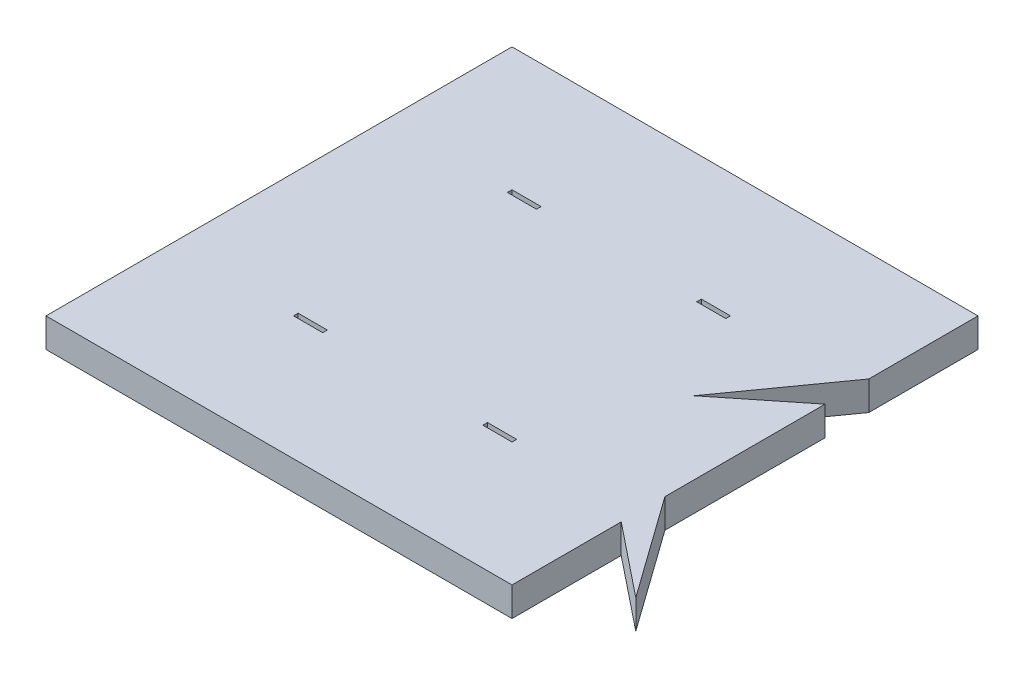
ISO-10303-21;
HEADER;
FILE_DESCRIPTION(('STEP AP214'),'2;1');
FILE_NAME('part.step','',(''),(''),'','','');
FILE_SCHEMA(('AUTOMOTIVE_DESIGN { 1 0 10303 214 1 1 1 1 }'));
ENDSEC;
DATA;
#1=APPLICATION_CONTEXT('core data for automotive mechanical design processes');
#2=APPLICATION_PROTOCOL_DEFINITION('international standard','automotive_design',2000,#1);
#3=PRODUCT_CONTEXT('',#1,'mechanical');
#4=PRODUCT('Part','Part','',(#3));
#5=PRODUCT_RELATED_PRODUCT_CATEGORY('part','',(#4));
#6=PRODUCT_DEFINITION_FORMATION('','',#4);
#7=PRODUCT_DEFINITION_CONTEXT('part definition',#1,'design');
#8=PRODUCT_DEFINITION('design','',#6,#7);
#9=PRODUCT_DEFINITION_SHAPE('','',#8);
#10=(LENGTH_UNIT() NAMED_UNIT(*) SI_UNIT(.MILLI.,.METRE.));
#11=(NAMED_UNIT(*) PLANE_ANGLE_UNIT() SI_UNIT($,.RADIAN.));
#12=(NAMED_UNIT(*) SI_UNIT($,.STERADIAN.) SOLID_ANGLE_UNIT());
#13=UNCERTAINTY_MEASURE_WITH_UNIT(LENGTH_MEASURE(1.E-05),#10,'distance_accuracy_value','');
#14=(GEOMETRIC_REPRESENTATION_CONTEXT(3) GLOBAL_UNCERTAINTY_ASSIGNED_CONTEXT((#13)) GLOBAL_UNIT_ASSIGNED_CONTEXT((#10,
#11,#12)) REPRESENTATION_CONTEXT('',''));
#15=CARTESIAN_POINT('',(0.,0.,0.));
#16=DIRECTION('',(0.,0.,1.));
#17=DIRECTION('',(1.,0.,0.));
#18=AXIS2_PLACEMENT_3D('',#15,#16,#17);
#19=CARTESIAN_POINT('',(0.,20.,0.));
#20=DIRECTION('',(1.,0.,0.));
#21=DIRECTION('',(0.,0.,-1.));
#22=AXIS2_PLACEMENT_3D('',#19,#20,#21);
#23=PLANE('',#22);
#24=DIRECTION('',(0.,0.,1.));
#25=VECTOR('',#24,1.);
#26=CARTESIAN_POINT('',(0.,0.,0.));
#27=LINE('',#26,#25);
#28=CARTESIAN_POINT('',(0.,0.,-320.));
#29=VERTEX_POINT('',#28);
#30=CARTESIAN_POINT('',(0.,0.,0.));
#31=VERTEX_POINT('',#30);
#32=EDGE_CURVE('E334',#29,#31,#27,.T.);
#33=ORIENTED_EDGE('',*,*,#32,.T.);
#34=DIRECTION('',(0.,-1.,0.));
#35=VECTOR('',#34,1.);
#36=CARTESIAN_POINT('',(0.,20.,0.));
#37=LINE('',#36,#35);
#38=CARTESIAN_POINT('',(0.,20.,0.));
#39=VERTEX_POINT('',#38);
#40=EDGE_CURVE('E11',#39,#31,#37,.T.);
#41=ORIENTED_EDGE('',*,*,#40,.F.);
#42=DIRECTION('',(0.,0.,1.));
#43=VECTOR('',#42,1.);
#44=CARTESIAN_POINT('',(0.,20.,0.));
#45=LINE('',#44,#43);
#46=CARTESIAN_POINT('',(0.,20.,-320.));
#47=VERTEX_POINT('',#46);
#48=EDGE_CURVE('E341',#47,#39,#45,.T.);
#49=ORIENTED_EDGE('',*,*,#48,.F.);
#50=DIRECTION('',(0.,-1.,0.));
#51=VECTOR('',#50,1.);
#52=CARTESIAN_POINT('',(0.,20.,-320.));
#53=LINE('',#52,#51);
#54=EDGE_CURVE('E363',#47,#29,#53,.T.);
#55=ORIENTED_EDGE('',*,*,#54,.T.);
#56=EDGE_LOOP('',(#33,#41,#49,#55));
#57=FACE_BOUND('',#56,.T.);
#58=ADVANCED_FACE('F33',(#57),#23,.F.);
#59=CARTESIAN_POINT('',(0.,20.,0.));
#60=DIRECTION('',(0.,0.,-1.));
#61=DIRECTION('',(-1.,0.,0.));
#62=AXIS2_PLACEMENT_3D('',#59,#60,#61);
#63=PLANE('',#62);
#64=DIRECTION('',(1.,0.,0.));
#65=VECTOR('',#64,1.);
#66=CARTESIAN_POINT('',(0.,0.,0.));
#67=LINE('',#66,#65);
#68=CARTESIAN_POINT('',(320.,0.,0.));
#69=VERTEX_POINT('',#68);
#70=EDGE_CURVE('E366',#31,#69,#67,.T.);
#71=ORIENTED_EDGE('',*,*,#70,.T.);
#72=DIRECTION('',(0.,-1.,0.));
#73=VECTOR('',#72,1.);
#74=CARTESIAN_POINT('',(320.,20.,0.));
#75=LINE('',#74,#73);
#76=CARTESIAN_POINT('',(320.,20.,0.));
#77=VERTEX_POINT('',#76);
#78=EDGE_CURVE('E40',#77,#69,#75,.T.);
#79=ORIENTED_EDGE('',*,*,#78,.F.);
#80=DIRECTION('',(1.,0.,0.));
#81=VECTOR('',#80,1.);
#82=CARTESIAN_POINT('',(0.,20.,0.));
#83=LINE('',#82,#81);
#84=EDGE_CURVE('E344',#39,#77,#83,.T.);
#85=ORIENTED_EDGE('',*,*,#84,.F.);
#86=ORIENTED_EDGE('',*,*,#40,.T.);
#87=EDGE_LOOP('',(#71,#79,#85,#86));
#88=FACE_BOUND('',#87,.T.);
#89=ADVANCED_FACE('F432',(#88),#63,.F.);
#90=CARTESIAN_POINT('',(320.,20.,0.));
#91=DIRECTION('',(-1.,0.,0.));
#92=DIRECTION('',(0.,0.,1.));
#93=AXIS2_PLACEMENT_3D('',#90,#91,#92);
#94=PLANE('',#93);
#95=DIRECTION('',(0.,0.,-1.));
#96=VECTOR('',#95,1.);
#97=CARTESIAN_POINT('',(320.,0.,0.));
#98=LINE('',#97,#96);
#99=CARTESIAN_POINT('',(320.,0.,-75.));
#100=VERTEX_POINT('',#99);
#101=EDGE_CURVE('E368',#69,#100,#98,.T.);
#102=ORIENTED_EDGE('',*,*,#101,.T.);
#103=DIRECTION('',(0.,-1.,0.));
#104=VECTOR('',#103,1.);
#105=CARTESIAN_POINT('',(320.,20.,-75.));
#106=LINE('',#105,#104);
#107=CARTESIAN_POINT('',(320.,20.,-75.));
#108=VERTEX_POINT('',#107);
#109=EDGE_CURVE('E403',#108,#100,#106,.T.);
#110=ORIENTED_EDGE('',*,*,#109,.F.);
#111=DIRECTION('',(0.,0.,-1.));
#112=VECTOR('',#111,1.);
#113=CARTESIAN_POINT('',(320.,20.,0.));
#114=LINE('',#113,#112);
#115=EDGE_CURVE('E347',#77,#108,#114,.T.);
#116=ORIENTED_EDGE('',*,*,#115,.F.);
#117=ORIENTED_EDGE('',*,*,#78,.T.);
#118=EDGE_LOOP('',(#102,#110,#116,#117));
#119=FACE_BOUND('',#118,.T.);
#120=ADVANCED_FACE('F410',(#119),#94,.F.);
#121=CARTESIAN_POINT('',(370.,20.,-35.));
#122=DIRECTION('',(0.624695047554424,0.,-0.78086880944303));
#123=DIRECTION('',(-0.78086880944303,0.,-0.624695047554424));
#124=AXIS2_PLACEMENT_3D('',#121,#122,#123);
#125=PLANE('',#124);
#126=DIRECTION('',(0.78086880944303,0.,0.624695047554424));
#127=VECTOR('',#126,1.);
#128=CARTESIAN_POINT('',(370.,0.,-35.));
#129=LINE('',#128,#127);
#130=CARTESIAN_POINT('',(370.,0.,-35.));
#131=VERTEX_POINT('',#130);
#132=EDGE_CURVE('E370',#100,#131,#129,.T.);
#133=ORIENTED_EDGE('',*,*,#132,.T.);
#134=DIRECTION('',(0.,-1.,0.));
#135=VECTOR('',#134,1.);
#136=CARTESIAN_POINT('',(370.,20.,-35.));
#137=LINE('',#136,#135);
#138=CARTESIAN_POINT('',(370.,20.,-35.));
#139=VERTEX_POINT('',#138);
#140=EDGE_CURVE('E400',#139,#131,#137,.T.);
#141=ORIENTED_EDGE('',*,*,#140,.F.);
#142=DIRECTION('',(0.78086880944303,0.,0.624695047554424));
#143=VECTOR('',#142,1.);
#144=CARTESIAN_POINT('',(370.,20.,-35.));
#145=LINE('',#144,#143);
#146=EDGE_CURVE('E349',#108,#139,#145,.T.);
#147=ORIENTED_EDGE('',*,*,#146,.F.);
#148=ORIENTED_EDGE('',*,*,#109,.T.);
#149=EDGE_LOOP('',(#133,#141,#147,#148));
#150=FACE_BOUND('',#149,.T.);
#151=ADVANCED_FACE('F420',(#150),#125,.F.);
#152=CARTESIAN_POINT('',(320.,20.,-105.));
#153=DIRECTION('',(-0.813733471206735,0.,0.581238193719096));
#154=DIRECTION('',(0.581238193719096,0.,0.813733471206735));
#155=AXIS2_PLACEMENT_3D('',#152,#153,#154);
#156=PLANE('',#155);
#157=DIRECTION('',(-0.581238193719096,0.,-0.813733471206735));
#158=VECTOR('',#157,1.);
#159=CARTESIAN_POINT('',(320.,0.,-105.));
#160=LINE('',#159,#158);
#161=CARTESIAN_POINT('',(320.,0.,-105.));
#162=VERTEX_POINT('',#161);
#163=EDGE_CURVE('E372',#131,#162,#160,.T.);
#164=ORIENTED_EDGE('',*,*,#163,.T.);
#165=DIRECTION('',(0.,-1.,0.));
#166=VECTOR('',#165,1.);
#167=CARTESIAN_POINT('',(320.,20.,-105.));
#168=LINE('',#167,#166);
#169=CARTESIAN_POINT('',(320.,20.,-105.));
#170=VERTEX_POINT('',#169);
#171=EDGE_CURVE('E397',#170,#162,#168,.T.);
#172=ORIENTED_EDGE('',*,*,#171,.F.);
#173=DIRECTION('',(-0.581238193719096,0.,-0.813733471206735));
#174=VECTOR('',#173,1.);
#175=CARTESIAN_POINT('',(320.,20.,-105.));
#176=LINE('',#175,#174);
#177=EDGE_CURVE('E351',#139,#170,#176,.T.);
#178=ORIENTED_EDGE('',*,*,#177,.F.);
#179=ORIENTED_EDGE('',*,*,#140,.T.);
#180=EDGE_LOOP('',(#164,#172,#178,#179));
#181=FACE_BOUND('',#180,.T.);
#182=ADVANCED_FACE('F424',(#181),#156,.F.);
#183=CARTESIAN_POINT('',(320.,20.,-105.));
#184=DIRECTION('',(-1.,0.,0.));
#185=DIRECTION('',(0.,0.,1.));
#186=AXIS2_PLACEMENT_3D('',#183,#184,#185);
#187=PLANE('',#186);
#188=DIRECTION('',(0.,0.,-1.));
#189=VECTOR('',#188,1.);
#190=CARTESIAN_POINT('',(320.,0.,-105.));
#191=LINE('',#190,#189);
#192=CARTESIAN_POINT('',(320.,0.,-215.));
#193=VERTEX_POINT('',#192);
#194=EDGE_CURVE('E374',#162,#193,#191,.T.);
#195=ORIENTED_EDGE('',*,*,#194,.T.);
#196=DIRECTION('',(0.,-1.,0.));
#197=VECTOR('',#196,1.);
#198=CARTESIAN_POINT('',(320.,20.,-215.));
#199=LINE('',#198,#197);
#200=CARTESIAN_POINT('',(320.,20.,-215.));
#201=VERTEX_POINT('',#200);
#202=EDGE_CURVE('E394',#201,#193,#199,.T.);
#203=ORIENTED_EDGE('',*,*,#202,.F.);
#204=DIRECTION('',(0.,0.,-1.));
#205=VECTOR('',#204,1.);
#206=CARTESIAN_POINT('',(320.,20.,-105.));
#207=LINE('',#206,#205);
#208=EDGE_CURVE('E353',#170,#201,#207,.T.);
#209=ORIENTED_EDGE('',*,*,#208,.F.);
#210=ORIENTED_EDGE('',*,*,#171,.T.);
#211=EDGE_LOOP('',(#195,#203,#209,#210));
#212=FACE_BOUND('',#211,.T.);
#213=ADVANCED_FACE('F455',(#212),#187,.F.);
#214=CARTESIAN_POINT('',(270.,20.,-175.));
#215=DIRECTION('',(0.624695047554424,0.,0.78086880944303));
#216=DIRECTION('',(0.78086880944303,0.,-0.624695047554424));
#217=AXIS2_PLACEMENT_3D('',#214,#215,#216);
#218=PLANE('',#217);
#219=DIRECTION('',(-0.78086880944303,0.,0.624695047554424));
#220=VECTOR('',#219,1.);
#221=CARTESIAN_POINT('',(270.,0.,-175.));
#222=LINE('',#221,#220);
#223=CARTESIAN_POINT('',(270.,0.,-175.));
#224=VERTEX_POINT('',#223);
#225=EDGE_CURVE('E376',#193,#224,#222,.T.);
#226=ORIENTED_EDGE('',*,*,#225,.T.);
#227=DIRECTION('',(0.,-1.,0.));
#228=VECTOR('',#227,1.);
#229=CARTESIAN_POINT('',(270.,20.,-175.));
#230=LINE('',#229,#228);
#231=CARTESIAN_POINT('',(270.,20.,-175.));
#232=VERTEX_POINT('',#231);
#233=EDGE_CURVE('E391',#232,#224,#230,.T.);
#234=ORIENTED_EDGE('',*,*,#233,.F.);
#235=DIRECTION('',(-0.78086880944303,0.,0.624695047554424));
#236=VECTOR('',#235,1.);
#237=CARTESIAN_POINT('',(270.,20.,-175.));
#238=LINE('',#237,#236);
#239=EDGE_CURVE('E355',#201,#232,#238,.T.);
#240=ORIENTED_EDGE('',*,*,#239,.F.);
#241=ORIENTED_EDGE('',*,*,#202,.T.);
#242=EDGE_LOOP('',(#226,#234,#240,#241));
#243=FACE_BOUND('',#242,.T.);
#244=ADVANCED_FACE('F452',(#243),#218,.F.);
#245=CARTESIAN_POINT('',(320.,20.,-245.));
#246=DIRECTION('',(-0.813733471206735,0.,-0.581238193719097));
#247=DIRECTION('',(-0.581238193719097,0.,0.813733471206735));
#248=AXIS2_PLACEMENT_3D('',#245,#246,#247);
#249=PLANE('',#248);
#250=DIRECTION('',(0.581238193719097,0.,-0.813733471206735));
#251=VECTOR('',#250,1.);
#252=CARTESIAN_POINT('',(320.,0.,-245.));
#253=LINE('',#252,#251);
#254=CARTESIAN_POINT('',(320.,0.,-245.));
#255=VERTEX_POINT('',#254);
#256=EDGE_CURVE('E378',#224,#255,#253,.T.);
#257=ORIENTED_EDGE('',*,*,#256,.T.);
#258=DIRECTION('',(0.,-1.,0.));
#259=VECTOR('',#258,1.);
#260=CARTESIAN_POINT('',(320.,20.,-245.));
#261=LINE('',#260,#259);
#262=CARTESIAN_POINT('',(320.,20.,-245.));
#263=VERTEX_POINT('',#262);
#264=EDGE_CURVE('E388',#263,#255,#261,.T.);
#265=ORIENTED_EDGE('',*,*,#264,.F.);
#266=DIRECTION('',(0.581238193719097,0.,-0.813733471206735));
#267=VECTOR('',#266,1.);
#268=CARTESIAN_POINT('',(320.,20.,-245.));
#269=LINE('',#268,#267);
#270=EDGE_CURVE('E357',#232,#263,#269,.T.);
#271=ORIENTED_EDGE('',*,*,#270,.F.);
#272=ORIENTED_EDGE('',*,*,#233,.T.);
#273=EDGE_LOOP('',(#257,#265,#271,#272));
#274=FACE_BOUND('',#273,.T.);
#275=ADVANCED_FACE('F448',(#274),#249,.F.);
#276=CARTESIAN_POINT('',(320.,20.,-245.));
#277=DIRECTION('',(-1.,0.,0.));
#278=DIRECTION('',(0.,0.,1.));
#279=AXIS2_PLACEMENT_3D('',#276,#277,#278);
#280=PLANE('',#279);
#281=DIRECTION('',(0.,0.,-1.));
#282=VECTOR('',#281,1.);
#283=CARTESIAN_POINT('',(320.,0.,-245.));
#284=LINE('',#283,#282);
#285=CARTESIAN_POINT('',(320.,0.,-320.));
#286=VERTEX_POINT('',#285);
#287=EDGE_CURVE('E380',#255,#286,#284,.T.);
#288=ORIENTED_EDGE('',*,*,#287,.T.);
#289=DIRECTION('',(0.,-1.,0.));
#290=VECTOR('',#289,1.);
#291=CARTESIAN_POINT('',(320.,20.,-320.));
#292=LINE('',#291,#290);
#293=CARTESIAN_POINT('',(320.,20.,-320.));
#294=VERTEX_POINT('',#293);
#295=EDGE_CURVE('E385',#294,#286,#292,.T.);
#296=ORIENTED_EDGE('',*,*,#295,.F.);
#297=DIRECTION('',(0.,0.,-1.));
#298=VECTOR('',#297,1.);
#299=CARTESIAN_POINT('',(320.,20.,-245.));
#300=LINE('',#299,#298);
#301=EDGE_CURVE('E359',#263,#294,#300,.T.);
#302=ORIENTED_EDGE('',*,*,#301,.F.);
#303=ORIENTED_EDGE('',*,*,#264,.T.);
#304=EDGE_LOOP('',(#288,#296,#302,#303));
#305=FACE_BOUND('',#304,.T.);
#306=ADVANCED_FACE('F444',(#305),#280,.F.);
#307=CARTESIAN_POINT('',(0.,20.,-320.));
#308=DIRECTION('',(0.,0.,1.));
#309=DIRECTION('',(1.,0.,0.));
#310=AXIS2_PLACEMENT_3D('',#307,#308,#309);
#311=PLANE('',#310);
#312=DIRECTION('',(-1.,0.,0.));
#313=VECTOR('',#312,1.);
#314=CARTESIAN_POINT('',(0.,0.,-320.));
#315=LINE('',#314,#313);
#316=EDGE_CURVE('E345',#286,#29,#315,.T.);
#317=ORIENTED_EDGE('',*,*,#316,.T.);
#318=ORIENTED_EDGE('',*,*,#54,.F.);
#319=DIRECTION('',(-1.,0.,0.));
#320=VECTOR('',#319,1.);
#321=CARTESIAN_POINT('',(0.,20.,-320.));
#322=LINE('',#321,#320);
#323=EDGE_CURVE('E361',#294,#47,#322,.T.);
#324=ORIENTED_EDGE('',*,*,#323,.F.);
#325=ORIENTED_EDGE('',*,*,#295,.T.);
#326=EDGE_LOOP('',(#317,#318,#324,#325));
#327=FACE_BOUND('',#326,.T.);
#328=ADVANCED_FACE('F439',(#327),#311,.F.);
#329=CARTESIAN_POINT('',(0.,20.,0.));
#330=DIRECTION('',(0.,-1.,0.));
#331=DIRECTION('',(0.,0.,-1.));
#332=AXIS2_PLACEMENT_3D('',#329,#330,#331);
#333=PLANE('',#332);
#334=DIRECTION('',(1.,0.,0.));
#335=VECTOR('',#334,1.);
#336=CARTESIAN_POINT('',(85.,20.,-231.825));
#337=LINE('',#336,#335);
#338=CARTESIAN_POINT('',(85.,20.,-231.825));
#339=VERTEX_POINT('',#338);
#340=CARTESIAN_POINT('',(105.,20.,-231.825));
#341=VERTEX_POINT('',#340);
#342=EDGE_CURVE('E263',#339,#341,#337,.T.);
#343=ORIENTED_EDGE('',*,*,#342,.F.);
#344=DIRECTION('',(0.,0.,1.));
#345=VECTOR('',#344,1.);
#346=CARTESIAN_POINT('',(85.,20.,-235.));
#347=LINE('',#346,#345);
#348=CARTESIAN_POINT('',(85.,20.,-235.));
#349=VERTEX_POINT('',#348);
#350=EDGE_CURVE('E47',#349,#339,#347,.T.);
#351=ORIENTED_EDGE('',*,*,#350,.F.);
#352=DIRECTION('',(-1.,0.,0.));
#353=VECTOR('',#352,1.);
#354=CARTESIAN_POINT('',(85.,20.,-235.));
#355=LINE('',#354,#353);
#356=CARTESIAN_POINT('',(105.,20.,-235.));
#357=VERTEX_POINT('',#356);
#358=EDGE_CURVE('E252',#357,#349,#355,.T.);
#359=ORIENTED_EDGE('',*,*,#358,.F.);
#360=DIRECTION('',(0.,0.,-1.));
#361=VECTOR('',#360,1.);
#362=CARTESIAN_POINT('',(105.,20.,-235.));
#363=LINE('',#362,#361);
#364=EDGE_CURVE('E267',#341,#357,#363,.T.);
#365=ORIENTED_EDGE('',*,*,#364,.F.);
#366=EDGE_LOOP('',(#343,#351,#359,#365));
#367=FACE_BOUND('',#366,.T.);
#368=DIRECTION('',(-1.,0.,0.));
#369=VECTOR('',#368,1.);
#370=CARTESIAN_POINT('',(235.,20.,-88.175));
#371=LINE('',#370,#369);
#372=CARTESIAN_POINT('',(235.,20.,-88.175));
#373=VERTEX_POINT('',#372);
#374=CARTESIAN_POINT('',(215.,20.,-88.175));
#375=VERTEX_POINT('',#374);
#376=EDGE_CURVE('E295',#373,#375,#371,.T.);
#377=ORIENTED_EDGE('',*,*,#376,.F.);
#378=DIRECTION('',(0.,0.,-1.));
#379=VECTOR('',#378,1.);
#380=CARTESIAN_POINT('',(235.,20.,-85.));
#381=LINE('',#380,#379);
#382=CARTESIAN_POINT('',(235.,20.,-85.));
#383=VERTEX_POINT('',#382);
#384=EDGE_CURVE('E55',#383,#373,#381,.T.);
#385=ORIENTED_EDGE('',*,*,#384,.F.);
#386=DIRECTION('',(1.,0.,0.));
#387=VECTOR('',#386,1.);
#388=CARTESIAN_POINT('',(235.,20.,-85.));
#389=LINE('',#388,#387);
#390=CARTESIAN_POINT('',(215.,20.,-85.));
#391=VERTEX_POINT('',#390);
#392=EDGE_CURVE('E284',#391,#383,#389,.T.);
#393=ORIENTED_EDGE('',*,*,#392,.F.);
#394=DIRECTION('',(0.,0.,1.));
#395=VECTOR('',#394,1.);
#396=CARTESIAN_POINT('',(215.,20.,-85.));
#397=LINE('',#396,#395);
#398=EDGE_CURVE('E298',#375,#391,#397,.T.);
#399=ORIENTED_EDGE('',*,*,#398,.F.);
#400=EDGE_LOOP('',(#377,#385,#393,#399));
#401=FACE_BOUND('',#400,.T.);
#402=DIRECTION('',(1.,0.,0.));
#403=VECTOR('',#402,1.);
#404=CARTESIAN_POINT('',(85.,20.,-85.));
#405=LINE('',#404,#403);
#406=CARTESIAN_POINT('',(85.,20.,-85.));
#407=VERTEX_POINT('',#406);
#408=CARTESIAN_POINT('',(105.,20.,-85.));
#409=VERTEX_POINT('',#408);
#410=EDGE_CURVE('E239',#407,#409,#405,.T.);
#411=ORIENTED_EDGE('',*,*,#410,.F.);
#412=DIRECTION('',(0.,0.,1.));
#413=VECTOR('',#412,1.);
#414=CARTESIAN_POINT('',(85.,20.,-85.));
#415=LINE('',#414,#413);
#416=CARTESIAN_POINT('',(85.,20.,-88.175));
#417=VERTEX_POINT('',#416);
#418=EDGE_CURVE('E212',#417,#407,#415,.T.);
#419=ORIENTED_EDGE('',*,*,#418,.F.);
#420=DIRECTION('',(-1.,0.,0.));
#421=VECTOR('',#420,1.);
#422=CARTESIAN_POINT('',(85.,20.,-88.175));
#423=LINE('',#422,#421);
#424=CARTESIAN_POINT('',(105.,20.,-88.175));
#425=VERTEX_POINT('',#424);
#426=EDGE_CURVE('E230',#425,#417,#423,.T.);
#427=ORIENTED_EDGE('',*,*,#426,.F.);
#428=DIRECTION('',(0.,0.,-1.));
#429=VECTOR('',#428,1.);
#430=CARTESIAN_POINT('',(105.,20.,-85.));
#431=LINE('',#430,#429);
#432=EDGE_CURVE('E233',#409,#425,#431,.T.);
#433=ORIENTED_EDGE('',*,*,#432,.F.);
#434=EDGE_LOOP('',(#411,#419,#427,#433));
#435=FACE_BOUND('',#434,.T.);
#436=DIRECTION('',(-1.,0.,0.));
#437=VECTOR('',#436,1.);
#438=CARTESIAN_POINT('',(235.,20.,-235.));
#439=LINE('',#438,#437);
#440=CARTESIAN_POINT('',(235.,20.,-235.));
#441=VERTEX_POINT('',#440);
#442=CARTESIAN_POINT('',(215.,20.,-235.));
#443=VERTEX_POINT('',#442);
#444=EDGE_CURVE('E324',#441,#443,#439,.T.);
#445=ORIENTED_EDGE('',*,*,#444,.F.);
#446=DIRECTION('',(0.,0.,-1.));
#447=VECTOR('',#446,1.);
#448=CARTESIAN_POINT('',(235.,20.,-235.));
#449=LINE('',#448,#447);
#450=CARTESIAN_POINT('',(235.,20.,-231.825));
#451=VERTEX_POINT('',#450);
#452=EDGE_CURVE('E274',#451,#441,#449,.T.);
#453=ORIENTED_EDGE('',*,*,#452,.F.);
#454=DIRECTION('',(1.,0.,0.));
#455=VECTOR('',#454,1.);
#456=CARTESIAN_POINT('',(235.,20.,-231.825));
#457=LINE('',#456,#455);
#458=CARTESIAN_POINT('',(215.,20.,-231.825));
#459=VERTEX_POINT('',#458);
#460=EDGE_CURVE('E313',#459,#451,#457,.T.);
#461=ORIENTED_EDGE('',*,*,#460,.F.);
#462=DIRECTION('',(0.,0.,1.));
#463=VECTOR('',#462,1.);
#464=CARTESIAN_POINT('',(215.,20.,-235.));
#465=LINE('',#464,#463);
#466=EDGE_CURVE('E327',#443,#459,#465,.T.);
#467=ORIENTED_EDGE('',*,*,#466,.F.);
#468=EDGE_LOOP('',(#445,#453,#461,#467));
#469=FACE_BOUND('',#468,.T.);
#470=ORIENTED_EDGE('',*,*,#48,.T.);
#471=ORIENTED_EDGE('',*,*,#84,.T.);
#472=ORIENTED_EDGE('',*,*,#115,.T.);
#473=ORIENTED_EDGE('',*,*,#146,.T.);
#474=ORIENTED_EDGE('',*,*,#177,.T.);
#475=ORIENTED_EDGE('',*,*,#208,.T.);
#476=ORIENTED_EDGE('',*,*,#239,.T.);
#477=ORIENTED_EDGE('',*,*,#270,.T.);
#478=ORIENTED_EDGE('',*,*,#301,.T.);
#479=ORIENTED_EDGE('',*,*,#323,.T.);
#480=EDGE_LOOP('',(#470,#471,#472,#473,#474,#475,#476,#477,#478,#479));
#481=FACE_BOUND('',#480,.T.);
#482=ADVANCED_FACE('F428',(#367,#401,#435,#469,#481),#333,.F.);
#483=CARTESIAN_POINT('',(0.,0.,0.));
#484=DIRECTION('',(0.,-1.,0.));
#485=DIRECTION('',(0.,0.,-1.));
#486=AXIS2_PLACEMENT_3D('',#483,#484,#485);
#487=PLANE('',#486);
#488=DIRECTION('',(0.,0.,1.));
#489=VECTOR('',#488,1.);
#490=CARTESIAN_POINT('',(85.,0.,-235.));
#491=LINE('',#490,#489);
#492=CARTESIAN_POINT('',(85.,0.,-235.));
#493=VERTEX_POINT('',#492);
#494=CARTESIAN_POINT('',(85.,0.,-231.825));
#495=VERTEX_POINT('',#494);
#496=EDGE_CURVE('E248',#493,#495,#491,.T.);
#497=ORIENTED_EDGE('',*,*,#496,.T.);
#498=DIRECTION('',(1.,0.,0.));
#499=VECTOR('',#498,1.);
#500=CARTESIAN_POINT('',(85.,0.,-231.825));
#501=LINE('',#500,#499);
#502=CARTESIAN_POINT('',(105.,0.,-231.825));
#503=VERTEX_POINT('',#502);
#504=EDGE_CURVE('E251',#495,#503,#501,.T.);
#505=ORIENTED_EDGE('',*,*,#504,.T.);
#506=DIRECTION('',(0.,0.,-1.));
#507=VECTOR('',#506,1.);
#508=CARTESIAN_POINT('',(105.,0.,-235.));
#509=LINE('',#508,#507);
#510=CARTESIAN_POINT('',(105.,0.,-235.));
#511=VERTEX_POINT('',#510);
#512=EDGE_CURVE('E255',#503,#511,#509,.T.);
#513=ORIENTED_EDGE('',*,*,#512,.T.);
#514=DIRECTION('',(-1.,0.,0.));
#515=VECTOR('',#514,1.);
#516=CARTESIAN_POINT('',(85.,0.,-235.));
#517=LINE('',#516,#515);
#518=EDGE_CURVE('E258',#511,#493,#517,.T.);
#519=ORIENTED_EDGE('',*,*,#518,.T.);
#520=EDGE_LOOP('',(#497,#505,#513,#519));
#521=FACE_BOUND('',#520,.T.);
#522=DIRECTION('',(0.,0.,-1.));
#523=VECTOR('',#522,1.);
#524=CARTESIAN_POINT('',(235.,0.,-85.));
#525=LINE('',#524,#523);
#526=CARTESIAN_POINT('',(235.,0.,-85.));
#527=VERTEX_POINT('',#526);
#528=CARTESIAN_POINT('',(235.,0.,-88.175));
#529=VERTEX_POINT('',#528);
#530=EDGE_CURVE('E280',#527,#529,#525,.T.);
#531=ORIENTED_EDGE('',*,*,#530,.T.);
#532=DIRECTION('',(-1.,0.,0.));
#533=VECTOR('',#532,1.);
#534=CARTESIAN_POINT('',(235.,0.,-88.175));
#535=LINE('',#534,#533);
#536=CARTESIAN_POINT('',(215.,0.,-88.175));
#537=VERTEX_POINT('',#536);
#538=EDGE_CURVE('E283',#529,#537,#535,.T.);
#539=ORIENTED_EDGE('',*,*,#538,.T.);
#540=DIRECTION('',(0.,0.,1.));
#541=VECTOR('',#540,1.);
#542=CARTESIAN_POINT('',(215.,0.,-85.));
#543=LINE('',#542,#541);
#544=CARTESIAN_POINT('',(215.,0.,-85.));
#545=VERTEX_POINT('',#544);
#546=EDGE_CURVE('E287',#537,#545,#543,.T.);
#547=ORIENTED_EDGE('',*,*,#546,.T.);
#548=DIRECTION('',(1.,0.,0.));
#549=VECTOR('',#548,1.);
#550=CARTESIAN_POINT('',(235.,0.,-85.));
#551=LINE('',#550,#549);
#552=EDGE_CURVE('E290',#545,#527,#551,.T.);
#553=ORIENTED_EDGE('',*,*,#552,.T.);
#554=EDGE_LOOP('',(#531,#539,#547,#553));
#555=FACE_BOUND('',#554,.T.);
#556=DIRECTION('',(0.,0.,1.));
#557=VECTOR('',#556,1.);
#558=CARTESIAN_POINT('',(85.,0.,-85.));
#559=LINE('',#558,#557);
#560=CARTESIAN_POINT('',(85.,0.,-88.175));
#561=VERTEX_POINT('',#560);
#562=CARTESIAN_POINT('',(85.,0.,-85.));
#563=VERTEX_POINT('',#562);
#564=EDGE_CURVE('E209',#561,#563,#559,.T.);
#565=ORIENTED_EDGE('',*,*,#564,.T.);
#566=DIRECTION('',(1.,0.,0.));
#567=VECTOR('',#566,1.);
#568=CARTESIAN_POINT('',(85.,0.,-85.));
#569=LINE('',#568,#567);
#570=CARTESIAN_POINT('',(105.,0.,-85.));
#571=VERTEX_POINT('',#570);
#572=EDGE_CURVE('E221',#563,#571,#569,.T.);
#573=ORIENTED_EDGE('',*,*,#572,.T.);
#574=DIRECTION('',(0.,0.,-1.));
#575=VECTOR('',#574,1.);
#576=CARTESIAN_POINT('',(105.,0.,-85.));
#577=LINE('',#576,#575);
#578=CARTESIAN_POINT('',(105.,0.,-88.175));
#579=VERTEX_POINT('',#578);
#580=EDGE_CURVE('E225',#571,#579,#577,.T.);
#581=ORIENTED_EDGE('',*,*,#580,.T.);
#582=DIRECTION('',(-1.,0.,0.));
#583=VECTOR('',#582,1.);
#584=CARTESIAN_POINT('',(85.,0.,-88.175));
#585=LINE('',#584,#583);
#586=EDGE_CURVE('E217',#579,#561,#585,.T.);
#587=ORIENTED_EDGE('',*,*,#586,.T.);
#588=EDGE_LOOP('',(#565,#573,#581,#587));
#589=FACE_BOUND('',#588,.T.);
#590=DIRECTION('',(0.,0.,-1.));
#591=VECTOR('',#590,1.);
#592=CARTESIAN_POINT('',(235.,0.,-235.));
#593=LINE('',#592,#591);
#594=CARTESIAN_POINT('',(235.,0.,-231.825));
#595=VERTEX_POINT('',#594);
#596=CARTESIAN_POINT('',(235.,0.,-235.));
#597=VERTEX_POINT('',#596);
#598=EDGE_CURVE('E309',#595,#597,#593,.T.);
#599=ORIENTED_EDGE('',*,*,#598,.T.);
#600=DIRECTION('',(-1.,0.,0.));
#601=VECTOR('',#600,1.);
#602=CARTESIAN_POINT('',(235.,0.,-235.));
#603=LINE('',#602,#601);
#604=CARTESIAN_POINT('',(215.,0.,-235.));
#605=VERTEX_POINT('',#604);
#606=EDGE_CURVE('E312',#597,#605,#603,.T.);
#607=ORIENTED_EDGE('',*,*,#606,.T.);
#608=DIRECTION('',(0.,0.,1.));
#609=VECTOR('',#608,1.);
#610=CARTESIAN_POINT('',(215.,0.,-235.));
#611=LINE('',#610,#609);
#612=CARTESIAN_POINT('',(215.,0.,-231.825));
#613=VERTEX_POINT('',#612);
#614=EDGE_CURVE('E316',#605,#613,#611,.T.);
#615=ORIENTED_EDGE('',*,*,#614,.T.);
#616=DIRECTION('',(1.,0.,0.));
#617=VECTOR('',#616,1.);
#618=CARTESIAN_POINT('',(235.,0.,-231.825));
#619=LINE('',#618,#617);
#620=EDGE_CURVE('E319',#613,#595,#619,.T.);
#621=ORIENTED_EDGE('',*,*,#620,.T.);
#622=EDGE_LOOP('',(#599,#607,#615,#621));
#623=FACE_BOUND('',#622,.T.);
#624=ORIENTED_EDGE('',*,*,#32,.F.);
#625=ORIENTED_EDGE('',*,*,#316,.F.);
#626=ORIENTED_EDGE('',*,*,#287,.F.);
#627=ORIENTED_EDGE('',*,*,#256,.F.);
#628=ORIENTED_EDGE('',*,*,#225,.F.);
#629=ORIENTED_EDGE('',*,*,#194,.F.);
#630=ORIENTED_EDGE('',*,*,#163,.F.);
#631=ORIENTED_EDGE('',*,*,#132,.F.);
#632=ORIENTED_EDGE('',*,*,#101,.F.);
#633=ORIENTED_EDGE('',*,*,#70,.F.);
#634=EDGE_LOOP('',(#624,#625,#626,#627,#628,#629,#630,#631,#632,#633));
#635=FACE_BOUND('',#634,.T.);
#636=ADVANCED_FACE('F227',(#521,#555,#589,#623,#635),#487,.T.);
#637=CARTESIAN_POINT('',(235.,0.,-235.));
#638=DIRECTION('',(1.,0.,0.));
#639=DIRECTION('',(0.,0.,-1.));
#640=AXIS2_PLACEMENT_3D('',#637,#638,#639);
#641=PLANE('',#640);
#642=ORIENTED_EDGE('',*,*,#452,.T.);
#643=DIRECTION('',(0.,1.,0.));
#644=VECTOR('',#643,1.);
#645=CARTESIAN_POINT('',(235.,0.,-235.));
#646=LINE('',#645,#644);
#647=EDGE_CURVE('E322',#597,#441,#646,.T.);
#648=ORIENTED_EDGE('',*,*,#647,.F.);
#649=ORIENTED_EDGE('',*,*,#598,.F.);
#650=DIRECTION('',(0.,1.,0.));
#651=VECTOR('',#650,1.);
#652=CARTESIAN_POINT('',(235.,0.,-231.825));
#653=LINE('',#652,#651);
#654=EDGE_CURVE('E332',#595,#451,#653,.T.);
#655=ORIENTED_EDGE('',*,*,#654,.T.);
#656=EDGE_LOOP('',(#642,#648,#649,#655));
#657=FACE_BOUND('',#656,.T.);
#658=ADVANCED_FACE('F534',(#657),#641,.F.);
#659=CARTESIAN_POINT('',(235.,0.,-231.825));
#660=DIRECTION('',(0.,0.,1.));
#661=DIRECTION('',(1.,0.,0.));
#662=AXIS2_PLACEMENT_3D('',#659,#660,#661);
#663=PLANE('',#662);
#664=ORIENTED_EDGE('',*,*,#460,.T.);
#665=ORIENTED_EDGE('',*,*,#654,.F.);
#666=ORIENTED_EDGE('',*,*,#620,.F.);
#667=DIRECTION('',(0.,1.,0.));
#668=VECTOR('',#667,1.);
#669=CARTESIAN_POINT('',(215.,0.,-231.825));
#670=LINE('',#669,#668);
#671=EDGE_CURVE('E335',#613,#459,#670,.T.);
#672=ORIENTED_EDGE('',*,*,#671,.T.);
#673=EDGE_LOOP('',(#664,#665,#666,#672));
#674=FACE_BOUND('',#673,.T.);
#675=ADVANCED_FACE('F544',(#674),#663,.F.);
#676=CARTESIAN_POINT('',(215.,0.,-235.));
#677=DIRECTION('',(-1.,0.,0.));
#678=DIRECTION('',(0.,0.,1.));
#679=AXIS2_PLACEMENT_3D('',#676,#677,#678);
#680=PLANE('',#679);
#681=ORIENTED_EDGE('',*,*,#466,.T.);
#682=ORIENTED_EDGE('',*,*,#671,.F.);
#683=ORIENTED_EDGE('',*,*,#614,.F.);
#684=DIRECTION('',(0.,1.,0.));
#685=VECTOR('',#684,1.);
#686=CARTESIAN_POINT('',(215.,0.,-235.));
#687=LINE('',#686,#685);
#688=EDGE_CURVE('E337',#605,#443,#687,.T.);
#689=ORIENTED_EDGE('',*,*,#688,.T.);
#690=EDGE_LOOP('',(#681,#682,#683,#689));
#691=FACE_BOUND('',#690,.T.);
#692=ADVANCED_FACE('F554',(#691),#680,.F.);
#693=CARTESIAN_POINT('',(235.,0.,-235.));
#694=DIRECTION('',(0.,0.,-1.));
#695=DIRECTION('',(-1.,0.,0.));
#696=AXIS2_PLACEMENT_3D('',#693,#694,#695);
#697=PLANE('',#696);
#698=ORIENTED_EDGE('',*,*,#444,.T.);
#699=ORIENTED_EDGE('',*,*,#688,.F.);
#700=ORIENTED_EDGE('',*,*,#606,.F.);
#701=ORIENTED_EDGE('',*,*,#647,.T.);
#702=EDGE_LOOP('',(#698,#699,#700,#701));
#703=FACE_BOUND('',#702,.T.);
#704=ADVANCED_FACE('F564',(#703),#697,.F.);
#705=CARTESIAN_POINT('',(85.,0.,-85.));
#706=DIRECTION('',(-1.,0.,0.));
#707=DIRECTION('',(0.,0.,1.));
#708=AXIS2_PLACEMENT_3D('',#705,#706,#707);
#709=PLANE('',#708);
#710=ORIENTED_EDGE('',*,*,#418,.T.);
#711=DIRECTION('',(0.,1.,0.));
#712=VECTOR('',#711,1.);
#713=CARTESIAN_POINT('',(85.,0.,-85.));
#714=LINE('',#713,#712);
#715=EDGE_CURVE('E205',#563,#407,#714,.T.);
#716=ORIENTED_EDGE('',*,*,#715,.F.);
#717=ORIENTED_EDGE('',*,*,#564,.F.);
#718=DIRECTION('',(0.,1.,0.));
#719=VECTOR('',#718,1.);
#720=CARTESIAN_POINT('',(85.,0.,-88.175));
#721=LINE('',#720,#719);
#722=EDGE_CURVE('E243',#561,#417,#721,.T.);
#723=ORIENTED_EDGE('',*,*,#722,.T.);
#724=EDGE_LOOP('',(#710,#716,#717,#723));
#725=FACE_BOUND('',#724,.T.);
#726=ADVANCED_FACE('F207',(#725),#709,.F.);
#727=CARTESIAN_POINT('',(85.,0.,-88.175));
#728=DIRECTION('',(0.,0.,-1.));
#729=DIRECTION('',(-1.,0.,0.));
#730=AXIS2_PLACEMENT_3D('',#727,#728,#729);
#731=PLANE('',#730);
#732=ORIENTED_EDGE('',*,*,#426,.T.);
#733=ORIENTED_EDGE('',*,*,#722,.F.);
#734=ORIENTED_EDGE('',*,*,#586,.F.);
#735=DIRECTION('',(0.,1.,0.));
#736=VECTOR('',#735,1.);
#737=CARTESIAN_POINT('',(105.,0.,-88.175));
#738=LINE('',#737,#736);
#739=EDGE_CURVE('E245',#579,#425,#738,.T.);
#740=ORIENTED_EDGE('',*,*,#739,.T.);
#741=EDGE_LOOP('',(#732,#733,#734,#740));
#742=FACE_BOUND('',#741,.T.);
#743=ADVANCED_FACE('F583',(#742),#731,.F.);
#744=CARTESIAN_POINT('',(105.,0.,-85.));
#745=DIRECTION('',(1.,0.,0.));
#746=DIRECTION('',(0.,0.,-1.));
#747=AXIS2_PLACEMENT_3D('',#744,#745,#746);
#748=PLANE('',#747);
#749=ORIENTED_EDGE('',*,*,#432,.T.);
#750=ORIENTED_EDGE('',*,*,#739,.F.);
#751=ORIENTED_EDGE('',*,*,#580,.F.);
#752=DIRECTION('',(0.,1.,0.));
#753=VECTOR('',#752,1.);
#754=CARTESIAN_POINT('',(105.,0.,-85.));
#755=LINE('',#754,#753);
#756=EDGE_CURVE('E216',#571,#409,#755,.T.);
#757=ORIENTED_EDGE('',*,*,#756,.T.);
#758=EDGE_LOOP('',(#749,#750,#751,#757));
#759=FACE_BOUND('',#758,.T.);
#760=ADVANCED_FACE('F592',(#759),#748,.F.);
#761=CARTESIAN_POINT('',(85.,0.,-85.));
#762=DIRECTION('',(0.,0.,1.));
#763=DIRECTION('',(1.,0.,0.));
#764=AXIS2_PLACEMENT_3D('',#761,#762,#763);
#765=PLANE('',#764);
#766=ORIENTED_EDGE('',*,*,#410,.T.);
#767=ORIENTED_EDGE('',*,*,#756,.F.);
#768=ORIENTED_EDGE('',*,*,#572,.F.);
#769=ORIENTED_EDGE('',*,*,#715,.T.);
#770=EDGE_LOOP('',(#766,#767,#768,#769));
#771=FACE_BOUND('',#770,.T.);
#772=ADVANCED_FACE('F222',(#771),#765,.F.);
#773=CARTESIAN_POINT('',(235.,0.,-85.));
#774=DIRECTION('',(1.,0.,0.));
#775=DIRECTION('',(0.,0.,-1.));
#776=AXIS2_PLACEMENT_3D('',#773,#774,#775);
#777=PLANE('',#776);
#778=ORIENTED_EDGE('',*,*,#384,.T.);
#779=DIRECTION('',(0.,1.,0.));
#780=VECTOR('',#779,1.);
#781=CARTESIAN_POINT('',(235.,0.,-88.175));
#782=LINE('',#781,#780);
#783=EDGE_CURVE('E293',#529,#373,#782,.T.);
#784=ORIENTED_EDGE('',*,*,#783,.F.);
#785=ORIENTED_EDGE('',*,*,#530,.F.);
#786=DIRECTION('',(0.,1.,0.));
#787=VECTOR('',#786,1.);
#788=CARTESIAN_POINT('',(235.,0.,-85.));
#789=LINE('',#788,#787);
#790=EDGE_CURVE('E264',#527,#383,#789,.T.);
#791=ORIENTED_EDGE('',*,*,#790,.T.);
#792=EDGE_LOOP('',(#778,#784,#785,#791));
#793=FACE_BOUND('',#792,.T.);
#794=ADVANCED_FACE('F611',(#793),#777,.F.);
#795=CARTESIAN_POINT('',(235.,0.,-85.));
#796=DIRECTION('',(0.,0.,1.));
#797=DIRECTION('',(1.,0.,0.));
#798=AXIS2_PLACEMENT_3D('',#795,#796,#797);
#799=PLANE('',#798);
#800=ORIENTED_EDGE('',*,*,#392,.T.);
#801=ORIENTED_EDGE('',*,*,#790,.F.);
#802=ORIENTED_EDGE('',*,*,#552,.F.);
#803=DIRECTION('',(0.,1.,0.));
#804=VECTOR('',#803,1.);
#805=CARTESIAN_POINT('',(215.,0.,-85.));
#806=LINE('',#805,#804);
#807=EDGE_CURVE('E304',#545,#391,#806,.T.);
#808=ORIENTED_EDGE('',*,*,#807,.T.);
#809=EDGE_LOOP('',(#800,#801,#802,#808));
#810=FACE_BOUND('',#809,.T.);
#811=ADVANCED_FACE('F620',(#810),#799,.F.);
#812=CARTESIAN_POINT('',(215.,0.,-85.));
#813=DIRECTION('',(-1.,0.,0.));
#814=DIRECTION('',(0.,0.,1.));
#815=AXIS2_PLACEMENT_3D('',#812,#813,#814);
#816=PLANE('',#815);
#817=ORIENTED_EDGE('',*,*,#398,.T.);
#818=ORIENTED_EDGE('',*,*,#807,.F.);
#819=ORIENTED_EDGE('',*,*,#546,.F.);
#820=DIRECTION('',(0.,1.,0.));
#821=VECTOR('',#820,1.);
#822=CARTESIAN_POINT('',(215.,0.,-88.175));
#823=LINE('',#822,#821);
#824=EDGE_CURVE('E306',#537,#375,#823,.T.);
#825=ORIENTED_EDGE('',*,*,#824,.T.);
#826=EDGE_LOOP('',(#817,#818,#819,#825));
#827=FACE_BOUND('',#826,.T.);
#828=ADVANCED_FACE('F629',(#827),#816,.F.);
#829=CARTESIAN_POINT('',(235.,0.,-88.175));
#830=DIRECTION('',(0.,0.,-1.));
#831=DIRECTION('',(-1.,0.,0.));
#832=AXIS2_PLACEMENT_3D('',#829,#830,#831);
#833=PLANE('',#832);
#834=ORIENTED_EDGE('',*,*,#376,.T.);
#835=ORIENTED_EDGE('',*,*,#824,.F.);
#836=ORIENTED_EDGE('',*,*,#538,.F.);
#837=ORIENTED_EDGE('',*,*,#783,.T.);
#838=EDGE_LOOP('',(#834,#835,#836,#837));
#839=FACE_BOUND('',#838,.T.);
#840=ADVANCED_FACE('F639',(#839),#833,.F.);
#841=CARTESIAN_POINT('',(85.,0.,-235.));
#842=DIRECTION('',(-1.,0.,0.));
#843=DIRECTION('',(0.,0.,1.));
#844=AXIS2_PLACEMENT_3D('',#841,#842,#843);
#845=PLANE('',#844);
#846=ORIENTED_EDGE('',*,*,#350,.T.);
#847=DIRECTION('',(0.,1.,0.));
#848=VECTOR('',#847,1.);
#849=CARTESIAN_POINT('',(85.,0.,-231.825));
#850=LINE('',#849,#848);
#851=EDGE_CURVE('E261',#495,#339,#850,.T.);
#852=ORIENTED_EDGE('',*,*,#851,.F.);
#853=ORIENTED_EDGE('',*,*,#496,.F.);
#854=DIRECTION('',(0.,1.,0.));
#855=VECTOR('',#854,1.);
#856=CARTESIAN_POINT('',(85.,0.,-235.));
#857=LINE('',#856,#855);
#858=EDGE_CURVE('E272',#493,#349,#857,.T.);
#859=ORIENTED_EDGE('',*,*,#858,.T.);
#860=EDGE_LOOP('',(#846,#852,#853,#859));
#861=FACE_BOUND('',#860,.T.);
#862=ADVANCED_FACE('F649',(#861),#845,.F.);
#863=CARTESIAN_POINT('',(85.,0.,-235.));
#864=DIRECTION('',(0.,0.,-1.));
#865=DIRECTION('',(-1.,0.,0.));
#866=AXIS2_PLACEMENT_3D('',#863,#864,#865);
#867=PLANE('',#866);
#868=ORIENTED_EDGE('',*,*,#358,.T.);
#869=ORIENTED_EDGE('',*,*,#858,.F.);
#870=ORIENTED_EDGE('',*,*,#518,.F.);
#871=DIRECTION('',(0.,1.,0.));
#872=VECTOR('',#871,1.);
#873=CARTESIAN_POINT('',(105.,0.,-235.));
#874=LINE('',#873,#872);
#875=EDGE_CURVE('E275',#511,#357,#874,.T.);
#876=ORIENTED_EDGE('',*,*,#875,.T.);
#877=EDGE_LOOP('',(#868,#869,#870,#876));
#878=FACE_BOUND('',#877,.T.);
#879=ADVANCED_FACE('F659',(#878),#867,.F.);
#880=CARTESIAN_POINT('',(105.,0.,-235.));
#881=DIRECTION('',(1.,0.,0.));
#882=DIRECTION('',(0.,0.,-1.));
#883=AXIS2_PLACEMENT_3D('',#880,#881,#882);
#884=PLANE('',#883);
#885=ORIENTED_EDGE('',*,*,#364,.T.);
#886=ORIENTED_EDGE('',*,*,#875,.F.);
#887=ORIENTED_EDGE('',*,*,#512,.F.);
#888=DIRECTION('',(0.,1.,0.));
#889=VECTOR('',#888,1.);
#890=CARTESIAN_POINT('',(105.,0.,-231.825));
#891=LINE('',#890,#889);
#892=EDGE_CURVE('E277',#503,#341,#891,.T.);
#893=ORIENTED_EDGE('',*,*,#892,.T.);
#894=EDGE_LOOP('',(#885,#886,#887,#893));
#895=FACE_BOUND('',#894,.T.);
#896=ADVANCED_FACE('F668',(#895),#884,.F.);
#897=CARTESIAN_POINT('',(85.,0.,-231.825));
#898=DIRECTION('',(0.,0.,1.));
#899=DIRECTION('',(1.,0.,0.));
#900=AXIS2_PLACEMENT_3D('',#897,#898,#899);
#901=PLANE('',#900);
#902=ORIENTED_EDGE('',*,*,#342,.T.);
#903=ORIENTED_EDGE('',*,*,#892,.F.);
#904=ORIENTED_EDGE('',*,*,#504,.F.);
#905=ORIENTED_EDGE('',*,*,#851,.T.);
#906=EDGE_LOOP('',(#902,#903,#904,#905));
#907=FACE_BOUND('',#906,.T.);
#908=ADVANCED_FACE('F678',(#907),#901,.F.);
#909=CLOSED_SHELL('',(#58,#89,#120,#151,#182,#213,#244,#275,#306,#328,#482,#636,#658,#675,#692,
#704,#726,#743,#760,#772,#794,#811,#828,#840,#862,#879,#896,#908));
#910=MANIFOLD_SOLID_BREP('B2',#909);
#911=ADVANCED_BREP_SHAPE_REPRESENTATION('',(#18,#910),#14);
#912=SHAPE_DEFINITION_REPRESENTATION(#9,#911);
ENDSEC;
END-ISO-10303-21;
